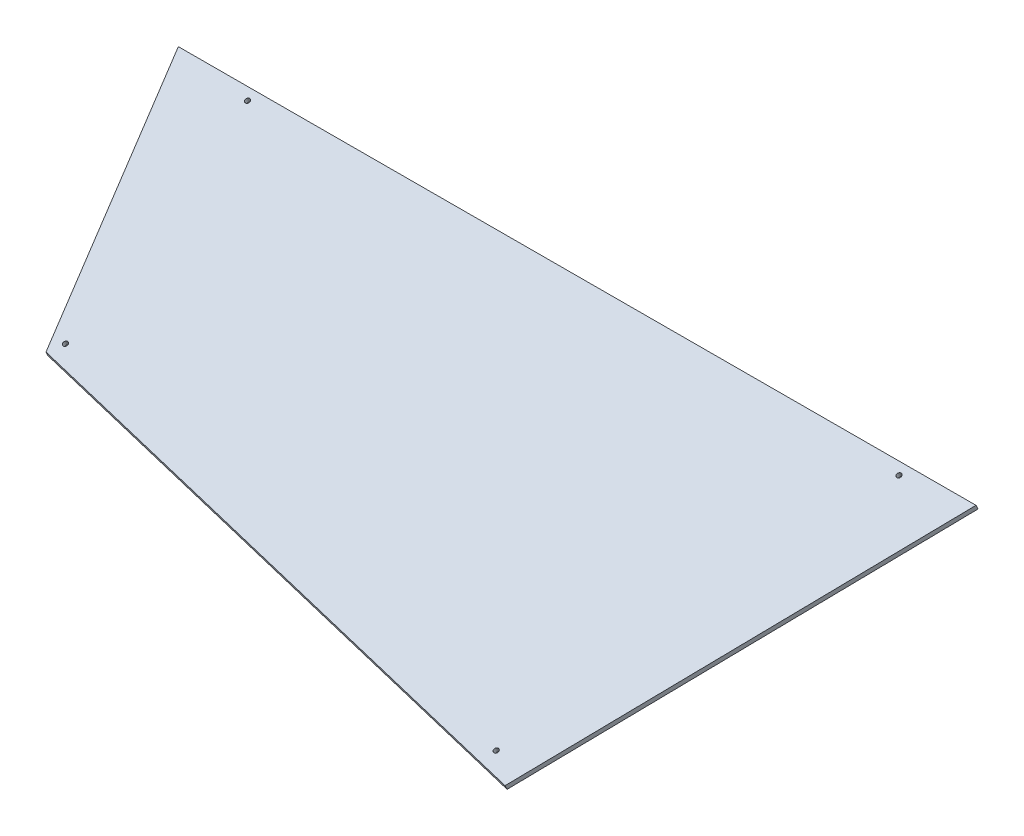
ISO-10303-21;
HEADER;
FILE_DESCRIPTION(('STEP AP214'),'2;1');
FILE_NAME('part.step','',(''),(''),'','','');
FILE_SCHEMA(('AUTOMOTIVE_DESIGN { 1 0 10303 214 1 1 1 1 }'));
ENDSEC;
DATA;
#1=APPLICATION_CONTEXT('core data for automotive mechanical design processes');
#2=APPLICATION_PROTOCOL_DEFINITION('international standard','automotive_design',2000,#1);
#3=PRODUCT_CONTEXT('',#1,'mechanical');
#4=PRODUCT('Part','Part','',(#3));
#5=PRODUCT_RELATED_PRODUCT_CATEGORY('part','',(#4));
#6=PRODUCT_DEFINITION_FORMATION('','',#4);
#7=PRODUCT_DEFINITION_CONTEXT('part definition',#1,'design');
#8=PRODUCT_DEFINITION('design','',#6,#7);
#9=PRODUCT_DEFINITION_SHAPE('','',#8);
#10=(LENGTH_UNIT() NAMED_UNIT(*) SI_UNIT(.MILLI.,.METRE.));
#11=(NAMED_UNIT(*) PLANE_ANGLE_UNIT() SI_UNIT($,.RADIAN.));
#12=(NAMED_UNIT(*) SI_UNIT($,.STERADIAN.) SOLID_ANGLE_UNIT());
#13=UNCERTAINTY_MEASURE_WITH_UNIT(LENGTH_MEASURE(1.E-05),#10,'distance_accuracy_value','');
#14=(GEOMETRIC_REPRESENTATION_CONTEXT(3) GLOBAL_UNCERTAINTY_ASSIGNED_CONTEXT((#13)) GLOBAL_UNIT_ASSIGNED_CONTEXT((#10,
#11,#12)) REPRESENTATION_CONTEXT('',''));
#15=CARTESIAN_POINT('',(0.,0.,0.));
#16=DIRECTION('',(0.,0.,1.));
#17=DIRECTION('',(1.,0.,0.));
#18=AXIS2_PLACEMENT_3D('',#15,#16,#17);
#19=CARTESIAN_POINT('',(-0.0303905117838536,-2102.0265336035,1621.71781978038));
#20=DIRECTION('',(0.00422190853313018,-0.906095441193539,-0.423052274472818));
#21=DIRECTION('',(0.,0.423056044873322,-0.906103516655874));
#22=AXIS2_PLACEMENT_3D('',#19,#20,#21);
#23=PLANE('',#22);
#24=CARTESIAN_POINT('',(-438.287886026909,-2005.85514981918,1411.36382607729));
#25=DIRECTION('',(0.00422190853313018,-0.906095441193539,-0.423052274472818));
#26=DIRECTION('',(0.,0.423056044873322,-0.906103516655874));
#27=AXIS2_PLACEMENT_3D('',#24,#25,#26);
#28=CIRCLE('',#27,3.175);
#29=CARTESIAN_POINT('',(-438.287886026909,-2004.51194687671,1408.48694741191));
#30=VERTEX_POINT('',#29);
#31=EDGE_CURVE('E90',#30,#30,#28,.T.);
#32=ORIENTED_EDGE('',*,*,#31,.T.);
#33=EDGE_LOOP('',(#32));
#34=FACE_BOUND('',#33,.T.);
#35=CARTESIAN_POINT('',(309.841686750654,-2193.55589645204,1820.84827023093));
#36=DIRECTION('',(0.00422190853313018,-0.906095441193539,-0.423052274472818));
#37=DIRECTION('',(0.,0.423056044873322,-0.906103516655874));
#38=AXIS2_PLACEMENT_3D('',#35,#36,#37);
#39=CIRCLE('',#38,3.175);
#40=CARTESIAN_POINT('',(309.841686750654,-2192.21269350957,1817.97139156554));
#41=VERTEX_POINT('',#40);
#42=EDGE_CURVE('E94',#41,#41,#39,.T.);
#43=ORIENTED_EDGE('',*,*,#42,.T.);
#44=EDGE_LOOP('',(#43));
#45=FACE_BOUND('',#44,.T.);
#46=CARTESIAN_POINT('',(-406.248881815042,-2136.46129067473,1691.41643828573));
#47=DIRECTION('',(0.00422190853313018,-0.906095441193539,-0.423052274472818));
#48=DIRECTION('',(0.,0.423056044873322,-0.906103516655874));
#49=AXIS2_PLACEMENT_3D('',#46,#47,#48);
#50=CIRCLE('',#49,3.175);
#51=CARTESIAN_POINT('',(-406.248881815042,-2135.11808773226,1688.53955962035));
#52=VERTEX_POINT('',#51);
#53=EDGE_CURVE('E96',#52,#52,#50,.T.);
#54=ORIENTED_EDGE('',*,*,#53,.T.);
#55=EDGE_LOOP('',(#54));
#56=FACE_BOUND('',#55,.T.);
#57=CARTESIAN_POINT('',(450.696267981967,-2002.45432292417,1412.95165831616));
#58=DIRECTION('',(0.00422190853313018,-0.906095441193539,-0.423052274472818));
#59=DIRECTION('',(0.,0.423056044873322,-0.906103516655874));
#60=AXIS2_PLACEMENT_3D('',#57,#58,#59);
#61=CIRCLE('',#60,3.175);
#62=CARTESIAN_POINT('',(450.696267981967,-2001.11111998169,1410.07477965078));
#63=VERTEX_POINT('',#62);
#64=EDGE_CURVE('E19',#63,#63,#61,.T.);
#65=ORIENTED_EDGE('',*,*,#64,.T.);
#66=EDGE_LOOP('',(#65));
#67=FACE_BOUND('',#66,.T.);
#68=DIRECTION('',(0.981039789113387,-0.0782192678831472,0.177320834388362));
#69=VECTOR('',#68,1.);
#70=CARTESIAN_POINT('',(-417.070984352619,-2143.81333589094,1707.05508420684));
#71=LINE('',#70,#69);
#72=CARTESIAN_POINT('',(-417.070984352918,-2143.81333589113,1707.05508420724));
#73=VERTEX_POINT('',#72);
#74=CARTESIAN_POINT('',(346.179562187804,-2204.66805312476,1845.01098085997));
#75=VERTEX_POINT('',#74);
#76=EDGE_CURVE('E103',#73,#75,#71,.T.);
#77=ORIENTED_EDGE('',*,*,#76,.T.);
#78=DIRECTION('',(0.374785223744527,0.393653370611547,-0.839388503536314));
#79=VECTOR('',#78,1.);
#80=CARTESIAN_POINT('',(346.179562187455,-2204.66805312464,1845.01098085972));
#81=LINE('',#80,#79);
#82=CARTESIAN_POINT('',(544.156699281397,-1996.72397640192,1401.61107523116));
#83=VERTEX_POINT('',#82);
#84=EDGE_CURVE('E54',#75,#83,#81,.T.);
#85=ORIENTED_EDGE('',*,*,#84,.T.);
#86=DIRECTION('',(-0.999991087704454,-0.00382548616886948,-0.00178610392584337));
#87=VECTOR('',#86,1.);
#88=CARTESIAN_POINT('',(544.156699281684,-1996.72397640192,1401.61107523117));
#89=LINE('',#88,#87);
#90=CARTESIAN_POINT('',(-544.229879282215,-2000.88762131235,1399.66708636521));
#91=VERTEX_POINT('',#90);
#92=EDGE_CURVE('E56',#83,#91,#89,.T.);
#93=ORIENTED_EDGE('',*,*,#92,.T.);
#94=DIRECTION('',(0.351213362969676,-0.394761380239893,0.849006847052852));
#95=VECTOR('',#94,1.);
#96=CARTESIAN_POINT('',(-544.229879282445,-2000.88762131242,1399.66708636536));
#97=LINE('',#96,#95);
#98=EDGE_CURVE('E58',#91,#73,#97,.T.);
#99=ORIENTED_EDGE('',*,*,#98,.T.);
#100=EDGE_LOOP('',(#77,#85,#93,#99));
#101=FACE_BOUND('',#100,.T.);
#102=ADVANCED_FACE('F16',(#34,#45,#56,#67,#101),#23,.F.);
#103=CARTESIAN_POINT('',(-470.450893623128,-2083.81468868055,1578.01697448958));
#104=DIRECTION('',(0.936285933441205,0.152166041281801,-0.316566180633302));
#105=DIRECTION('',(-0.320296045935456,0.,-0.947317498496736));
#106=AXIS2_PLACEMENT_3D('',#103,#104,#105);
#107=PLANE('',#106);
#108=DIRECTION('',(-0.00422190826307553,0.906095441171979,0.42305227452169));
#109=VECTOR('',#108,1.);
#110=CARTESIAN_POINT('',(-417.044175235148,-2149.56704194243,1704.36870226361));
#111=LINE('',#110,#109);
#112=CARTESIAN_POINT('',(-417.04417523485,-2149.56704194224,1704.36870226321));
#113=VERTEX_POINT('',#112);
#114=EDGE_CURVE('E69',#113,#73,#111,.T.);
#115=ORIENTED_EDGE('',*,*,#114,.T.);
#116=ORIENTED_EDGE('',*,*,#98,.F.);
#117=DIRECTION('',(0.00422190838434425,-0.906095441194131,-0.423052274473035));
#118=VECTOR('',#117,1.);
#119=CARTESIAN_POINT('',(-544.229879282139,-2000.88762131224,1399.66708636496));
#120=LINE('',#119,#118);
#121=CARTESIAN_POINT('',(-544.203070163745,-2006.64132736374,1396.98070442176));
#122=VERTEX_POINT('',#121);
#123=EDGE_CURVE('E63',#91,#122,#120,.T.);
#124=ORIENTED_EDGE('',*,*,#123,.T.);
#125=DIRECTION('',(-0.351213362969264,0.394761380239957,-0.849006847052993));
#126=VECTOR('',#125,1.);
#127=CARTESIAN_POINT('',(-417.044175235054,-2149.56704194223,1704.36870226317));
#128=LINE('',#127,#126);
#129=EDGE_CURVE('E93',#113,#122,#128,.T.);
#130=ORIENTED_EDGE('',*,*,#129,.F.);
#131=EDGE_LOOP('',(#115,#116,#124,#130));
#132=FACE_BOUND('',#131,.T.);
#133=ADVANCED_FACE('F66',(#132),#107,.F.);
#134=CARTESIAN_POINT('',(-36.7692399542864,-1998.94632035387,1400.57347188301));
#135=DIRECTION('',(0.,-0.423056044873294,0.906103516655887));
#136=DIRECTION('',(0.,-0.906103516655887,-0.423056044873294));
#137=AXIS2_PLACEMENT_3D('',#134,#135,#136);
#138=PLANE('',#137);
#139=ORIENTED_EDGE('',*,*,#123,.F.);
#140=ORIENTED_EDGE('',*,*,#92,.F.);
#141=DIRECTION('',(0.00422190844418996,-0.906095441286978,-0.423052274273576));
#142=VECTOR('',#141,1.);
#143=CARTESIAN_POINT('',(544.156699281213,-1996.72397640163,1401.61107523054));
#144=LINE('',#143,#142);
#145=CARTESIAN_POINT('',(544.183508399566,-2002.4776824536,1398.92469328833));
#146=VERTEX_POINT('',#145);
#147=EDGE_CURVE('E77',#83,#146,#144,.T.);
#148=ORIENTED_EDGE('',*,*,#147,.T.);
#149=DIRECTION('',(0.999991087704454,0.0038254861688687,0.00178610392584298));
#150=VECTOR('',#149,1.);
#151=CARTESIAN_POINT('',(-0.00358139259848318,-2004.5594811923,1397.95270992787));
#152=LINE('',#151,#150);
#153=EDGE_CURVE('E74',#122,#146,#152,.T.);
#154=ORIENTED_EDGE('',*,*,#153,.F.);
#155=EDGE_LOOP('',(#139,#140,#148,#154));
#156=FACE_BOUND('',#155,.T.);
#157=ADVANCED_FACE('F72',(#156),#138,.F.);
#158=CARTESIAN_POINT('',(424.551166269604,-2122.3509174624,1669.48585526113));
#159=DIRECTION('',(-0.927102050235627,0.155009919858205,-0.34125315118611));
#160=DIRECTION('',(-0.345428373804897,0.,0.938445117505816));
#161=AXIS2_PLACEMENT_3D('',#158,#159,#160);
#162=PLANE('',#161);
#163=ORIENTED_EDGE('',*,*,#147,.F.);
#164=ORIENTED_EDGE('',*,*,#84,.F.);
#165=DIRECTION('',(0.004221908332303,-0.906095441177489,-0.423052274509197));
#166=VECTOR('',#165,1.);
#167=CARTESIAN_POINT('',(346.17956218785,-2204.66805312495,1845.01098086038));
#168=LINE('',#167,#166);
#169=CARTESIAN_POINT('',(346.206371305932,-2210.42175917668,1842.32459891767));
#170=VERTEX_POINT('',#169);
#171=EDGE_CURVE('E34',#75,#170,#168,.T.);
#172=ORIENTED_EDGE('',*,*,#171,.T.);
#173=DIRECTION('',(-0.374785223744579,-0.393653370611536,0.839388503536296));
#174=VECTOR('',#173,1.);
#175=CARTESIAN_POINT('',(544.183508399364,-2002.47768245378,1398.9246932887));
#176=LINE('',#175,#174);
#177=EDGE_CURVE('E110',#146,#170,#176,.T.);
#178=ORIENTED_EDGE('',*,*,#177,.F.);
#179=EDGE_LOOP('',(#163,#164,#172,#178));
#180=FACE_BOUND('',#179,.T.);
#181=ADVANCED_FACE('F111',(#180),#162,.F.);
#182=CARTESIAN_POINT('',(-28.1216276110646,-2174.82465089115,1777.35684488728));
#183=DIRECTION('',(0.193760438853493,0.415779746476585,-0.888585445950567));
#184=DIRECTION('',(0.,0.905750436995009,0.423811450863884));
#185=AXIS2_PLACEMENT_3D('',#182,#183,#184);
#186=PLANE('',#185);
#187=ORIENTED_EDGE('',*,*,#171,.F.);
#188=ORIENTED_EDGE('',*,*,#76,.F.);
#189=ORIENTED_EDGE('',*,*,#114,.F.);
#190=DIRECTION('',(-0.981039789113133,0.0782192678836947,-0.17732083438953));
#191=VECTOR('',#190,1.);
#192=CARTESIAN_POINT('',(346.206371305657,-2210.4217591767,1842.3245989177));
#193=LINE('',#192,#191);
#194=EDGE_CURVE('E89',#170,#113,#193,.T.);
#195=ORIENTED_EDGE('',*,*,#194,.F.);
#196=EDGE_LOOP('',(#187,#188,#189,#195));
#197=FACE_BOUND('',#196,.T.);
#198=ADVANCED_FACE('F118',(#197),#186,.F.);
#199=CARTESIAN_POINT('',(2782.92716822902,-502540.012145804,-232285.997336627));
#200=DIRECTION('',(0.00422190853313018,-0.906095441193539,-0.423052274472818));
#201=DIRECTION('',(0.,0.423056044873322,-0.906103516655874));
#202=AXIS2_PLACEMENT_3D('',#199,#200,#201);
#203=CYLINDRICAL_SURFACE('',#202,3.175);
#204=ORIENTED_EDGE('',*,*,#64,.F.);
#205=EDGE_LOOP('',(#204));
#206=FACE_BOUND('',#205,.T.);
#207=CARTESIAN_POINT('',(450.723077101153,-2008.20802897584,1410.2652763732));
#208=DIRECTION('',(0.00422190853313018,-0.906095441193539,-0.423052274472818));
#209=DIRECTION('',(0.,0.423056044873322,-0.906103516655874));
#210=AXIS2_PLACEMENT_3D('',#207,#208,#209);
#211=CIRCLE('',#210,3.175);
#212=CARTESIAN_POINT('',(450.723077101153,-2006.86482603337,1407.38839770781));
#213=VERTEX_POINT('',#212);
#214=EDGE_CURVE('E86',#213,#213,#211,.F.);
#215=ORIENTED_EDGE('',*,*,#214,.F.);
#216=EDGE_LOOP('',(#215));
#217=FACE_BOUND('',#216,.T.);
#218=ADVANCED_FACE('F120',(#206,#217),#203,.F.);
#219=CARTESIAN_POINT('',(1925.35761936063,-502540.012147836,-231944.965249655));
#220=DIRECTION('',(0.00422190853313018,-0.906095441193539,-0.423052274472818));
#221=DIRECTION('',(0.,0.423056044873322,-0.906103516655874));
#222=AXIS2_PLACEMENT_3D('',#219,#220,#221);
#223=CYLINDRICAL_SURFACE('',#222,3.175);
#224=ORIENTED_EDGE('',*,*,#53,.F.);
#225=EDGE_LOOP('',(#224));
#226=FACE_BOUND('',#225,.T.);
#227=CARTESIAN_POINT('',(-406.222072695857,-2142.21499672624,1688.73005634288));
#228=DIRECTION('',(0.00422190853313018,-0.906095441193539,-0.423052274472818));
#229=DIRECTION('',(0.,0.423056044873322,-0.906103516655874));
#230=AXIS2_PLACEMENT_3D('',#227,#228,#229);
#231=CIRCLE('',#230,3.175);
#232=CARTESIAN_POINT('',(-406.222072695857,-2140.87179378377,1685.85317767749));
#233=VERTEX_POINT('',#232);
#234=EDGE_CURVE('E83',#233,#233,#231,.F.);
#235=ORIENTED_EDGE('',*,*,#234,.F.);
#236=EDGE_LOOP('',(#235));
#237=FACE_BOUND('',#236,.T.);
#238=ADVANCED_FACE('F127',(#226,#237),#223,.F.);
#239=CARTESIAN_POINT('',(2641.18215833124,-502540.012147836,-231788.876178598));
#240=DIRECTION('',(0.00422190853313018,-0.906095441193539,-0.423052274472818));
#241=DIRECTION('',(0.,0.423056044873322,-0.906103516655874));
#242=AXIS2_PLACEMENT_3D('',#239,#240,#241);
#243=CYLINDRICAL_SURFACE('',#242,3.175);
#244=ORIENTED_EDGE('',*,*,#42,.F.);
#245=EDGE_LOOP('',(#244));
#246=FACE_BOUND('',#245,.T.);
#247=CARTESIAN_POINT('',(309.868495869839,-2199.30960250349,1818.16188828807));
#248=DIRECTION('',(0.00422190853313018,-0.906095441193539,-0.423052274472818));
#249=DIRECTION('',(0.,0.423056044873322,-0.906103516655874));
#250=AXIS2_PLACEMENT_3D('',#247,#248,#249);
#251=CIRCLE('',#250,3.175);
#252=CARTESIAN_POINT('',(309.868495869839,-2197.96639956102,1815.28500962269));
#253=VERTEX_POINT('',#252);
#254=EDGE_CURVE('E25',#253,#253,#251,.F.);
#255=ORIENTED_EDGE('',*,*,#254,.F.);
#256=EDGE_LOOP('',(#255));
#257=FACE_BOUND('',#256,.T.);
#258=ADVANCED_FACE('F138',(#246,#257),#243,.F.);
#259=CARTESIAN_POINT('',(1893.92716822927,-502540.012145804,-232285.997336627));
#260=DIRECTION('',(0.00422190853313018,-0.906095441193539,-0.423052274472818));
#261=DIRECTION('',(0.,0.423056044873322,-0.906103516655874));
#262=AXIS2_PLACEMENT_3D('',#259,#260,#261);
#263=CYLINDRICAL_SURFACE('',#262,3.175);
#264=ORIENTED_EDGE('',*,*,#31,.F.);
#265=EDGE_LOOP('',(#264));
#266=FACE_BOUND('',#265,.T.);
#267=CARTESIAN_POINT('',(-438.261076907725,-2011.60885587046,1408.67744413453));
#268=DIRECTION('',(0.00422190853313018,-0.906095441193539,-0.423052274472818));
#269=DIRECTION('',(0.,0.423056044873322,-0.906103516655874));
#270=AXIS2_PLACEMENT_3D('',#267,#268,#269);
#271=CIRCLE('',#270,3.175);
#272=CARTESIAN_POINT('',(-438.261076907725,-2010.26565292799,1405.80056546914));
#273=VERTEX_POINT('',#272);
#274=EDGE_CURVE('E11',#273,#273,#271,.F.);
#275=ORIENTED_EDGE('',*,*,#274,.F.);
#276=EDGE_LOOP('',(#275));
#277=FACE_BOUND('',#276,.T.);
#278=ADVANCED_FACE('F132',(#266,#277),#263,.F.);
#279=CARTESIAN_POINT('',(-0.00358139259848318,-2107.78023965512,1619.03143783743));
#280=DIRECTION('',(0.00422190853313018,-0.906095441193539,-0.423052274472818));
#281=DIRECTION('',(0.,0.423056044873322,-0.906103516655874));
#282=AXIS2_PLACEMENT_3D('',#279,#280,#281);
#283=PLANE('',#282);
#284=ORIENTED_EDGE('',*,*,#274,.T.);
#285=EDGE_LOOP('',(#284));
#286=FACE_BOUND('',#285,.T.);
#287=ORIENTED_EDGE('',*,*,#254,.T.);
#288=EDGE_LOOP('',(#287));
#289=FACE_BOUND('',#288,.T.);
#290=ORIENTED_EDGE('',*,*,#234,.T.);
#291=EDGE_LOOP('',(#290));
#292=FACE_BOUND('',#291,.T.);
#293=ORIENTED_EDGE('',*,*,#214,.T.);
#294=EDGE_LOOP('',(#293));
#295=FACE_BOUND('',#294,.T.);
#296=ORIENTED_EDGE('',*,*,#177,.T.);
#297=ORIENTED_EDGE('',*,*,#194,.T.);
#298=ORIENTED_EDGE('',*,*,#129,.T.);
#299=ORIENTED_EDGE('',*,*,#153,.T.);
#300=EDGE_LOOP('',(#296,#297,#298,#299));
#301=FACE_BOUND('',#300,.T.);
#302=ADVANCED_FACE('F115',(#286,#289,#292,#295,#301),#283,.T.);
#303=CLOSED_SHELL('',(#102,#133,#157,#181,#198,#218,#238,#258,#278,#302));
#304=MANIFOLD_SOLID_BREP('B1',#303);
#305=ADVANCED_BREP_SHAPE_REPRESENTATION('',(#18,#304),#14);
#306=SHAPE_DEFINITION_REPRESENTATION(#9,#305);
ENDSEC;
END-ISO-10303-21;
